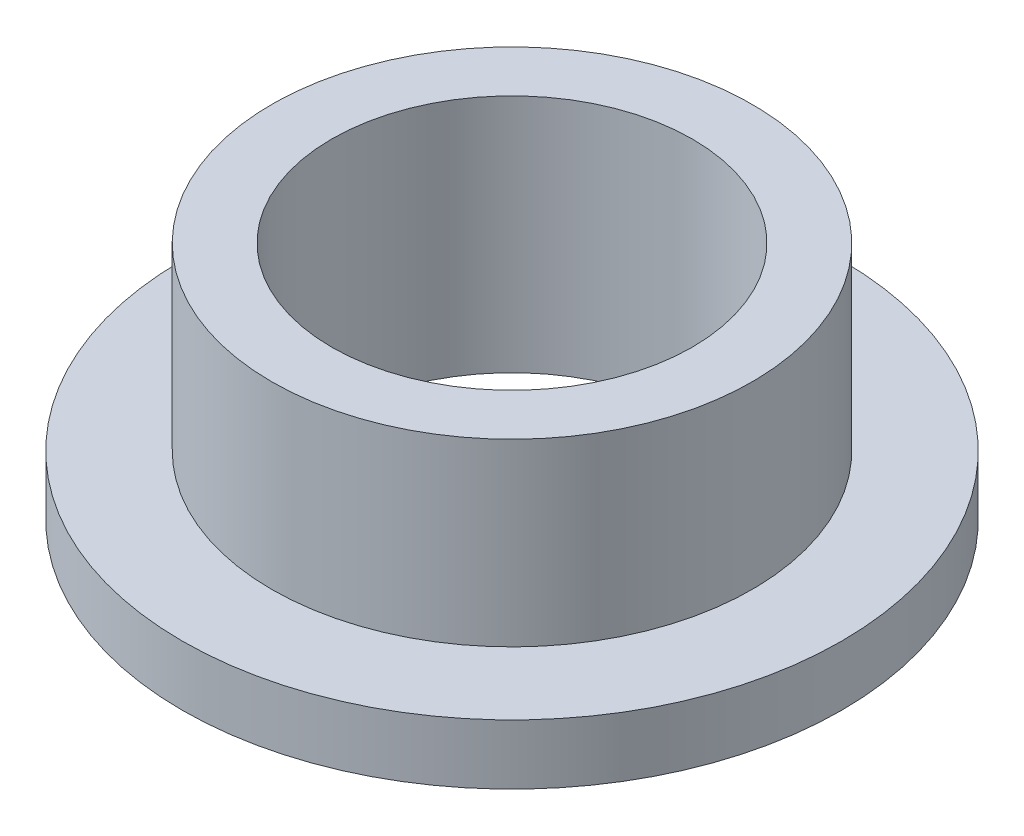
ISO-10303-21;
HEADER;
FILE_DESCRIPTION(('STEP AP214'),'2;1');
FILE_NAME('part.step','',(''),(''),'','','');
FILE_SCHEMA(('AUTOMOTIVE_DESIGN { 1 0 10303 214 1 1 1 1 }'));
ENDSEC;
DATA;
#1=APPLICATION_CONTEXT('core data for automotive mechanical design processes');
#2=APPLICATION_PROTOCOL_DEFINITION('international standard','automotive_design',2000,#1);
#3=PRODUCT_CONTEXT('',#1,'mechanical');
#4=PRODUCT('Part','Part','',(#3));
#5=PRODUCT_RELATED_PRODUCT_CATEGORY('part','',(#4));
#6=PRODUCT_DEFINITION_FORMATION('','',#4);
#7=PRODUCT_DEFINITION_CONTEXT('part definition',#1,'design');
#8=PRODUCT_DEFINITION('design','',#6,#7);
#9=PRODUCT_DEFINITION_SHAPE('','',#8);
#10=(LENGTH_UNIT() NAMED_UNIT(*) SI_UNIT(.MILLI.,.METRE.));
#11=(NAMED_UNIT(*) PLANE_ANGLE_UNIT() SI_UNIT($,.RADIAN.));
#12=(NAMED_UNIT(*) SI_UNIT($,.STERADIAN.) SOLID_ANGLE_UNIT());
#13=UNCERTAINTY_MEASURE_WITH_UNIT(LENGTH_MEASURE(1.E-05),#10,'distance_accuracy_value','');
#14=(GEOMETRIC_REPRESENTATION_CONTEXT(3) GLOBAL_UNCERTAINTY_ASSIGNED_CONTEXT((#13)) GLOBAL_UNIT_ASSIGNED_CONTEXT((#10,
#11,#12)) REPRESENTATION_CONTEXT('',''));
#15=CARTESIAN_POINT('',(0.,0.,0.));
#16=DIRECTION('',(0.,0.,1.));
#17=DIRECTION('',(1.,0.,0.));
#18=AXIS2_PLACEMENT_3D('',#15,#16,#17);
#19=CARTESIAN_POINT('',(0.,6.35,0.));
#20=DIRECTION('',(0.,1.,0.));
#21=DIRECTION('',(0.,0.,1.));
#22=AXIS2_PLACEMENT_3D('',#19,#20,#21);
#23=PLANE('',#22);
#24=CARTESIAN_POINT('',(0.,6.35,0.));
#25=DIRECTION('',(0.,1.,0.));
#26=DIRECTION('',(0.,0.,1.));
#27=AXIS2_PLACEMENT_3D('',#24,#25,#26);
#28=CIRCLE('',#27,6.3627);
#29=CARTESIAN_POINT('',(0.,6.35,6.3627));
#30=VERTEX_POINT('',#29);
#31=EDGE_CURVE('E10',#30,#30,#28,.T.);
#32=ORIENTED_EDGE('',*,*,#31,.T.);
#33=EDGE_LOOP('',(#32));
#34=FACE_BOUND('',#33,.T.);
#35=CARTESIAN_POINT('',(0.,6.35,0.));
#36=DIRECTION('',(0.,1.,0.));
#37=DIRECTION('',(0.,0.,1.));
#38=AXIS2_PLACEMENT_3D('',#35,#36,#37);
#39=CIRCLE('',#38,4.7752);
#40=CARTESIAN_POINT('',(0.,6.35,4.7752));
#41=VERTEX_POINT('',#40);
#42=EDGE_CURVE('E37',#41,#41,#39,.T.);
#43=ORIENTED_EDGE('',*,*,#42,.F.);
#44=EDGE_LOOP('',(#43));
#45=FACE_BOUND('',#44,.T.);
#46=ADVANCED_FACE('F30',(#34,#45),#23,.T.);
#47=CARTESIAN_POINT('',(0.,0.,0.));
#48=DIRECTION('',(0.,1.,0.));
#49=DIRECTION('',(0.,0.,1.));
#50=AXIS2_PLACEMENT_3D('',#47,#48,#49);
#51=PLANE('',#50);
#52=CARTESIAN_POINT('',(0.,0.,0.));
#53=DIRECTION('',(0.,1.,0.));
#54=DIRECTION('',(0.,0.,1.));
#55=AXIS2_PLACEMENT_3D('',#52,#53,#54);
#56=CIRCLE('',#55,4.7752);
#57=CARTESIAN_POINT('',(0.,0.,4.7752));
#58=VERTEX_POINT('',#57);
#59=EDGE_CURVE('E41',#58,#58,#56,.T.);
#60=ORIENTED_EDGE('',*,*,#59,.T.);
#61=EDGE_LOOP('',(#60));
#62=FACE_BOUND('',#61,.T.);
#63=CARTESIAN_POINT('',(0.,0.,0.));
#64=DIRECTION('',(0.,1.,0.));
#65=DIRECTION('',(0.,0.,1.));
#66=AXIS2_PLACEMENT_3D('',#63,#64,#65);
#67=CIRCLE('',#66,8.73125);
#68=CARTESIAN_POINT('',(0.,0.,8.73125));
#69=VERTEX_POINT('',#68);
#70=EDGE_CURVE('E48',#69,#69,#67,.T.);
#71=ORIENTED_EDGE('',*,*,#70,.F.);
#72=EDGE_LOOP('',(#71));
#73=FACE_BOUND('',#72,.T.);
#74=ADVANCED_FACE('F73',(#62,#73),#51,.F.);
#75=CARTESIAN_POINT('',(0.,6.35,0.));
#76=DIRECTION('',(0.,-1.,0.));
#77=DIRECTION('',(0.,0.,-1.));
#78=AXIS2_PLACEMENT_3D('',#75,#76,#77);
#79=CYLINDRICAL_SURFACE('',#78,6.3627);
#80=CARTESIAN_POINT('',(0.,1.5875,0.));
#81=DIRECTION('',(0.,1.,0.));
#82=DIRECTION('',(0.,0.,1.));
#83=AXIS2_PLACEMENT_3D('',#80,#81,#82);
#84=CIRCLE('',#83,6.3627);
#85=CARTESIAN_POINT('',(0.,1.5875,6.3627));
#86=VERTEX_POINT('',#85);
#87=EDGE_CURVE('E51',#86,#86,#84,.T.);
#88=ORIENTED_EDGE('',*,*,#87,.T.);
#89=EDGE_LOOP('',(#88));
#90=FACE_BOUND('',#89,.T.);
#91=ORIENTED_EDGE('',*,*,#31,.F.);
#92=EDGE_LOOP('',(#91));
#93=FACE_BOUND('',#92,.T.);
#94=ADVANCED_FACE('F32',(#90,#93),#79,.T.);
#95=CARTESIAN_POINT('',(0.,6.35,0.));
#96=DIRECTION('',(0.,-1.,0.));
#97=DIRECTION('',(0.,0.,-1.));
#98=AXIS2_PLACEMENT_3D('',#95,#96,#97);
#99=CYLINDRICAL_SURFACE('',#98,4.7752);
#100=ORIENTED_EDGE('',*,*,#42,.T.);
#101=EDGE_LOOP('',(#100));
#102=FACE_BOUND('',#101,.T.);
#103=ORIENTED_EDGE('',*,*,#59,.F.);
#104=EDGE_LOOP('',(#103));
#105=FACE_BOUND('',#104,.T.);
#106=ADVANCED_FACE('F62',(#102,#105),#99,.F.);
#107=CARTESIAN_POINT('',(0.,1.5875,0.));
#108=DIRECTION('',(0.,1.,0.));
#109=DIRECTION('',(0.,0.,1.));
#110=AXIS2_PLACEMENT_3D('',#107,#108,#109);
#111=PLANE('',#110);
#112=CARTESIAN_POINT('',(0.,1.5875,0.));
#113=DIRECTION('',(0.,1.,0.));
#114=DIRECTION('',(0.,0.,1.));
#115=AXIS2_PLACEMENT_3D('',#112,#113,#114);
#116=CIRCLE('',#115,8.73125);
#117=CARTESIAN_POINT('',(0.,1.5875,8.73125));
#118=VERTEX_POINT('',#117);
#119=EDGE_CURVE('E46',#118,#118,#116,.T.);
#120=ORIENTED_EDGE('',*,*,#119,.T.);
#121=EDGE_LOOP('',(#120));
#122=FACE_BOUND('',#121,.T.);
#123=ORIENTED_EDGE('',*,*,#87,.F.);
#124=EDGE_LOOP('',(#123));
#125=FACE_BOUND('',#124,.T.);
#126=ADVANCED_FACE('F59',(#122,#125),#111,.T.);
#127=CARTESIAN_POINT('',(0.,1.5875,0.));
#128=DIRECTION('',(0.,-1.,0.));
#129=DIRECTION('',(0.,0.,-1.));
#130=AXIS2_PLACEMENT_3D('',#127,#128,#129);
#131=CYLINDRICAL_SURFACE('',#130,8.73125);
#132=ORIENTED_EDGE('',*,*,#119,.F.);
#133=EDGE_LOOP('',(#132));
#134=FACE_BOUND('',#133,.T.);
#135=ORIENTED_EDGE('',*,*,#70,.T.);
#136=EDGE_LOOP('',(#135));
#137=FACE_BOUND('',#136,.T.);
#138=ADVANCED_FACE('F61',(#134,#137),#131,.T.);
#139=CLOSED_SHELL('',(#46,#74,#94,#106,#126,#138));
#140=MANIFOLD_SOLID_BREP('B2',#139);
#141=ADVANCED_BREP_SHAPE_REPRESENTATION('',(#18,#140),#14);
#142=SHAPE_DEFINITION_REPRESENTATION(#9,#141);
ENDSEC;
END-ISO-10303-21;
